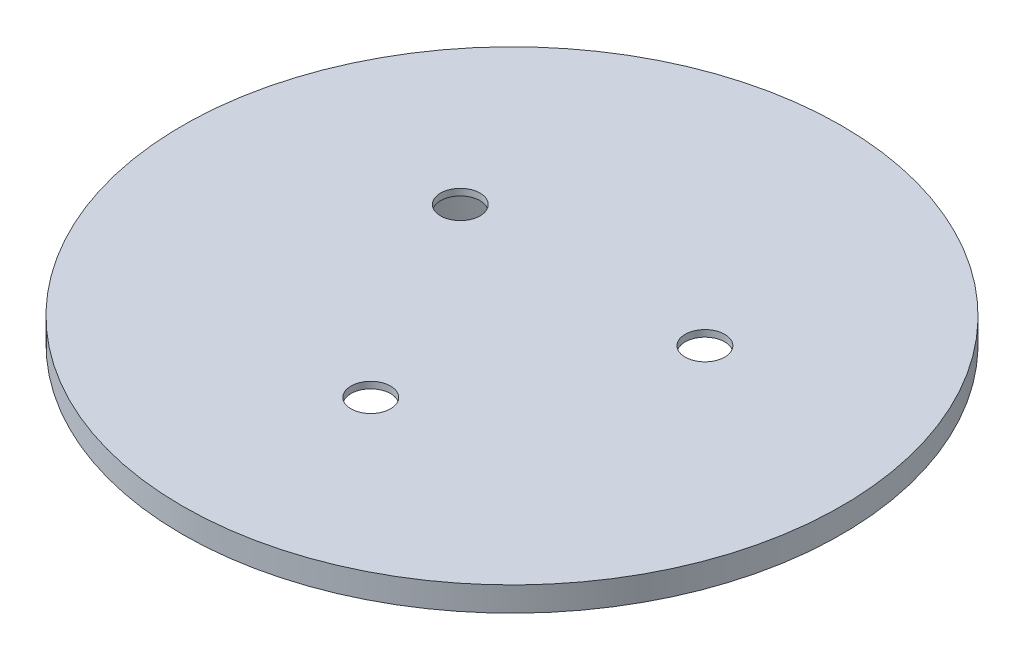
ISO-10303-21;
HEADER;
FILE_DESCRIPTION(('STEP AP214'),'2;1');
FILE_NAME('part.step','',(''),(''),'','','');
FILE_SCHEMA(('AUTOMOTIVE_DESIGN { 1 0 10303 214 1 1 1 1 }'));
ENDSEC;
DATA;
#1=APPLICATION_CONTEXT('core data for automotive mechanical design processes');
#2=APPLICATION_PROTOCOL_DEFINITION('international standard','automotive_design',2000,#1);
#3=PRODUCT_CONTEXT('',#1,'mechanical');
#4=PRODUCT('Part','Part','',(#3));
#5=PRODUCT_RELATED_PRODUCT_CATEGORY('part','',(#4));
#6=PRODUCT_DEFINITION_FORMATION('','',#4);
#7=PRODUCT_DEFINITION_CONTEXT('part definition',#1,'design');
#8=PRODUCT_DEFINITION('design','',#6,#7);
#9=PRODUCT_DEFINITION_SHAPE('','',#8);
#10=(LENGTH_UNIT() NAMED_UNIT(*) SI_UNIT(.MILLI.,.METRE.));
#11=(NAMED_UNIT(*) PLANE_ANGLE_UNIT() SI_UNIT($,.RADIAN.));
#12=(NAMED_UNIT(*) SI_UNIT($,.STERADIAN.) SOLID_ANGLE_UNIT());
#13=UNCERTAINTY_MEASURE_WITH_UNIT(LENGTH_MEASURE(1.E-05),#10,'distance_accuracy_value','');
#14=(GEOMETRIC_REPRESENTATION_CONTEXT(3) GLOBAL_UNCERTAINTY_ASSIGNED_CONTEXT((#13)) GLOBAL_UNIT_ASSIGNED_CONTEXT((#10,
#11,#12)) REPRESENTATION_CONTEXT('',''));
#15=CARTESIAN_POINT('',(0.,0.,0.));
#16=DIRECTION('',(0.,0.,1.));
#17=DIRECTION('',(1.,0.,0.));
#18=AXIS2_PLACEMENT_3D('',#15,#16,#17);
#19=CARTESIAN_POINT('',(0.,3.1,0.));
#20=DIRECTION('',(0.,-1.,0.));
#21=DIRECTION('',(0.,0.,-1.));
#22=AXIS2_PLACEMENT_3D('',#19,#20,#21);
#23=CYLINDRICAL_SURFACE('',#22,24.8);
#24=CARTESIAN_POINT('',(0.,3.1,0.));
#25=DIRECTION('',(0.,1.,0.));
#26=DIRECTION('',(0.,0.,1.));
#27=AXIS2_PLACEMENT_3D('',#24,#25,#26);
#28=CIRCLE('',#27,24.8);
#29=CARTESIAN_POINT('',(0.,3.1,-24.8));
#30=VERTEX_POINT('',#29);
#31=EDGE_CURVE('E10',#30,#30,#28,.T.);
#32=CARTESIAN_POINT('',(0.,0.,0.));
#33=DIRECTION('',(0.,1.,0.));
#34=DIRECTION('',(0.,0.,1.));
#35=AXIS2_PLACEMENT_3D('',#32,#33,#34);
#36=CIRCLE('',#35,24.8);
#37=CARTESIAN_POINT('',(0.,0.,-24.8));
#38=VERTEX_POINT('',#37);
#39=EDGE_CURVE('E35',#38,#38,#36,.T.);
#40=CARTESIAN_POINT('',(0.,3.1,-24.8));
#41=CARTESIAN_POINT('',(0.,3.06770833333333,-24.8));
#42=CARTESIAN_POINT('',(0.,3.03541666666667,-24.8));
#43=CARTESIAN_POINT('',(0.,2.97083333333333,-24.8));
#44=CARTESIAN_POINT('',(0.,2.93854166666667,-24.8));
#45=CARTESIAN_POINT('',(0.,2.87395833333333,-24.8));
#46=CARTESIAN_POINT('',(0.,2.84166666666667,-24.8));
#47=CARTESIAN_POINT('',(0.,2.77708333333333,-24.8));
#48=CARTESIAN_POINT('',(0.,2.74479166666667,-24.8));
#49=CARTESIAN_POINT('',(0.,2.68020833333333,-24.8));
#50=CARTESIAN_POINT('',(0.,2.64791666666667,-24.8));
#51=CARTESIAN_POINT('',(0.,2.58333333333333,-24.8));
#52=CARTESIAN_POINT('',(0.,2.55104166666667,-24.8));
#53=CARTESIAN_POINT('',(0.,2.48645833333333,-24.8));
#54=CARTESIAN_POINT('',(0.,2.45416666666667,-24.8));
#55=CARTESIAN_POINT('',(0.,2.38958333333333,-24.8));
#56=CARTESIAN_POINT('',(0.,2.35729166666667,-24.8));
#57=CARTESIAN_POINT('',(0.,2.29270833333333,-24.8));
#58=CARTESIAN_POINT('',(0.,2.26041666666667,-24.8));
#59=CARTESIAN_POINT('',(0.,2.19583333333333,-24.8));
#60=CARTESIAN_POINT('',(0.,2.16354166666667,-24.8));
#61=CARTESIAN_POINT('',(0.,2.09895833333333,-24.8));
#62=CARTESIAN_POINT('',(0.,2.06666666666667,-24.8));
#63=CARTESIAN_POINT('',(0.,2.00208333333333,-24.8));
#64=CARTESIAN_POINT('',(0.,1.96979166666667,-24.8));
#65=CARTESIAN_POINT('',(0.,1.90520833333333,-24.8));
#66=CARTESIAN_POINT('',(0.,1.87291666666667,-24.8));
#67=CARTESIAN_POINT('',(0.,1.80833333333333,-24.8));
#68=CARTESIAN_POINT('',(0.,1.77604166666667,-24.8));
#69=CARTESIAN_POINT('',(0.,1.71145833333333,-24.8));
#70=CARTESIAN_POINT('',(0.,1.67916666666667,-24.8));
#71=CARTESIAN_POINT('',(0.,1.61458333333333,-24.8));
#72=CARTESIAN_POINT('',(0.,1.58229166666667,-24.8));
#73=CARTESIAN_POINT('',(0.,1.51770833333333,-24.8));
#74=CARTESIAN_POINT('',(0.,1.48541666666667,-24.8));
#75=CARTESIAN_POINT('',(0.,1.42083333333333,-24.8));
#76=CARTESIAN_POINT('',(0.,1.38854166666667,-24.8));
#77=CARTESIAN_POINT('',(0.,1.32395833333333,-24.8));
#78=CARTESIAN_POINT('',(0.,1.29166666666667,-24.8));
#79=CARTESIAN_POINT('',(0.,1.22708333333333,-24.8));
#80=CARTESIAN_POINT('',(0.,1.19479166666667,-24.8));
#81=CARTESIAN_POINT('',(0.,1.13020833333333,-24.8));
#82=CARTESIAN_POINT('',(0.,1.09791666666667,-24.8));
#83=CARTESIAN_POINT('',(0.,1.03333333333333,-24.8));
#84=CARTESIAN_POINT('',(0.,1.00104166666667,-24.8));
#85=CARTESIAN_POINT('',(0.,0.936458333333333,-24.8));
#86=CARTESIAN_POINT('',(0.,0.904166666666667,-24.8));
#87=CARTESIAN_POINT('',(0.,0.839583333333333,-24.8));
#88=CARTESIAN_POINT('',(0.,0.807291666666667,-24.8));
#89=CARTESIAN_POINT('',(0.,0.742708333333333,-24.8));
#90=CARTESIAN_POINT('',(0.,0.710416666666667,-24.8));
#91=CARTESIAN_POINT('',(0.,0.645833333333333,-24.8));
#92=CARTESIAN_POINT('',(0.,0.613541666666667,-24.8));
#93=CARTESIAN_POINT('',(0.,0.548958333333333,-24.8));
#94=CARTESIAN_POINT('',(0.,0.516666666666667,-24.8));
#95=CARTESIAN_POINT('',(0.,0.452083333333333,-24.8));
#96=CARTESIAN_POINT('',(0.,0.419791666666667,-24.8));
#97=CARTESIAN_POINT('',(0.,0.355208333333333,-24.8));
#98=CARTESIAN_POINT('',(0.,0.322916666666667,-24.8));
#99=CARTESIAN_POINT('',(0.,0.258333333333333,-24.8));
#100=CARTESIAN_POINT('',(0.,0.226041666666667,-24.8));
#101=CARTESIAN_POINT('',(0.,0.161458333333333,-24.8));
#102=CARTESIAN_POINT('',(0.,0.129166666666667,-24.8));
#103=CARTESIAN_POINT('',(0.,0.0645833333333335,-24.8));
#104=CARTESIAN_POINT('',(0.,0.0322916666666667,-24.8));
#105=CARTESIAN_POINT('',(0.,0.,-24.8));
#106=B_SPLINE_CURVE_WITH_KNOTS('',3,(#40,#41,#42,#43,#44,#45,#46,#47,#48,#49,#50,#51,#52,#53,
#54,#55,#56,#57,#58,#59,#60,#61,#62,#63,#64,#65,#66,#67,#68,#69,#70,#71,#72,#73,#74,#75,#76,#77,
#78,#79,#80,#81,#82,#83,#84,#85,#86,#87,#88,#89,#90,#91,#92,#93,#94,#95,#96,#97,#98,#99,#100,
#101,#102,#103,#104,#105),.UNSPECIFIED.,.F.,.F.,(4,2,2,2,2,2,2,2,2,2,2,2,2,2,2,2,2,2,2,2,2,2,2,
2,2,2,2,2,2,2,2,2,4),(0.,0.0968749999999997,0.19375,0.290625,0.3875,0.484375,0.58125,0.678125,
0.775,0.871874999999999,0.96875,1.065625,1.1625,1.259375,1.35625,1.453125,1.55,1.646875,1.74375,
1.840625,1.9375,2.034375,2.13125,2.228125,2.325,2.421875,2.51875,2.615625,2.7125,2.809375,
2.90625,3.003125,3.1),.UNSPECIFIED.);
#107=EDGE_CURVE('BSEAM32',#30,#38,#106,.T.);
#108=ORIENTED_EDGE('',*,*,#31,.F.);
#109=ORIENTED_EDGE('',*,*,#39,.T.);
#110=ORIENTED_EDGE('',*,*,#107,.T.);
#111=ORIENTED_EDGE('',*,*,#107,.F.);
#112=EDGE_LOOP('',(#108,#110,#109,#111));
#113=FACE_BOUND('',#112,.T.);
#114=ADVANCED_FACE('F32',(#113),#23,.T.);
#115=CARTESIAN_POINT('',(0.,0.,0.));
#116=DIRECTION('',(0.,1.,0.));
#117=DIRECTION('',(0.,0.,1.));
#118=AXIS2_PLACEMENT_3D('',#115,#116,#117);
#119=PLANE('',#118);
#120=CARTESIAN_POINT('',(0.,0.,0.));
#121=DIRECTION('',(0.,-1.,0.));
#122=DIRECTION('',(0.,0.,-1.));
#123=AXIS2_PLACEMENT_3D('',#120,#121,#122);
#124=CIRCLE('',#123,20.05);
#125=CARTESIAN_POINT('',(0.,0.,-20.05));
#126=VERTEX_POINT('',#125);
#127=EDGE_CURVE('E50',#126,#126,#124,.T.);
#128=ORIENTED_EDGE('',*,*,#127,.F.);
#129=EDGE_LOOP('',(#128));
#130=FACE_BOUND('',#129,.T.);
#131=ORIENTED_EDGE('',*,*,#39,.F.);
#132=EDGE_LOOP('',(#131));
#133=FACE_BOUND('',#132,.T.);
#134=ADVANCED_FACE('F94',(#130,#133),#119,.F.);
#135=CARTESIAN_POINT('',(0.,5.7,0.));
#136=DIRECTION('',(0.,-1.,0.));
#137=DIRECTION('',(0.,0.,-1.));
#138=AXIS2_PLACEMENT_3D('',#135,#136,#137);
#139=CYLINDRICAL_SURFACE('',#138,35.);
#140=CARTESIAN_POINT('',(0.,5.7,0.));
#141=DIRECTION('',(0.,1.,0.));
#142=DIRECTION('',(0.,0.,1.));
#143=AXIS2_PLACEMENT_3D('',#140,#141,#142);
#144=CIRCLE('',#143,35.);
#145=CARTESIAN_POINT('',(0.,5.7,35.));
#146=VERTEX_POINT('',#145);
#147=EDGE_CURVE('E42',#146,#146,#144,.T.);
#148=ORIENTED_EDGE('',*,*,#147,.F.);
#149=EDGE_LOOP('',(#148));
#150=FACE_BOUND('',#149,.T.);
#151=CARTESIAN_POINT('',(0.,3.1,0.));
#152=DIRECTION('',(0.,1.,0.));
#153=DIRECTION('',(0.,0.,1.));
#154=AXIS2_PLACEMENT_3D('',#151,#152,#153);
#155=CIRCLE('',#154,35.);
#156=CARTESIAN_POINT('',(0.,3.1,35.));
#157=VERTEX_POINT('',#156);
#158=EDGE_CURVE('E44',#157,#157,#155,.T.);
#159=ORIENTED_EDGE('',*,*,#158,.T.);
#160=EDGE_LOOP('',(#159));
#161=FACE_BOUND('',#160,.T.);
#162=ADVANCED_FACE('F97',(#150,#161),#139,.T.);
#163=CARTESIAN_POINT('',(0.,5.7,0.));
#164=DIRECTION('',(0.,1.,0.));
#165=DIRECTION('',(0.,0.,1.));
#166=AXIS2_PLACEMENT_3D('',#163,#164,#165);
#167=PLANE('',#166);
#168=CARTESIAN_POINT('',(0.,5.7,15.));
#169=DIRECTION('',(0.,1.,0.));
#170=DIRECTION('',(0.,0.,1.));
#171=AXIS2_PLACEMENT_3D('',#168,#169,#170);
#172=CIRCLE('',#171,2.1);
#173=CARTESIAN_POINT('',(0.,5.7,17.1));
#174=VERTEX_POINT('',#173);
#175=EDGE_CURVE('E68',#174,#174,#172,.F.);
#176=ORIENTED_EDGE('',*,*,#175,.T.);
#177=EDGE_LOOP('',(#176));
#178=FACE_BOUND('',#177,.T.);
#179=CARTESIAN_POINT('',(-12.9903810567665,5.7,-7.50000000000006));
#180=DIRECTION('',(0.,1.,0.));
#181=DIRECTION('',(0.,0.,1.));
#182=AXIS2_PLACEMENT_3D('',#179,#180,#181);
#183=CIRCLE('',#182,2.1);
#184=CARTESIAN_POINT('',(-12.9903810567665,5.7,-5.40000000000006));
#185=VERTEX_POINT('',#184);
#186=EDGE_CURVE('E65',#185,#185,#183,.F.);
#187=ORIENTED_EDGE('',*,*,#186,.T.);
#188=EDGE_LOOP('',(#187));
#189=FACE_BOUND('',#188,.T.);
#190=CARTESIAN_POINT('',(12.9903810567665,5.7,-7.50000000000006));
#191=DIRECTION('',(0.,1.,0.));
#192=DIRECTION('',(0.,0.,1.));
#193=AXIS2_PLACEMENT_3D('',#190,#191,#192);
#194=CIRCLE('',#193,2.1);
#195=CARTESIAN_POINT('',(12.9903810567665,5.7,-5.40000000000006));
#196=VERTEX_POINT('',#195);
#197=EDGE_CURVE('E59',#196,#196,#194,.F.);
#198=ORIENTED_EDGE('',*,*,#197,.T.);
#199=EDGE_LOOP('',(#198));
#200=FACE_BOUND('',#199,.T.);
#201=ORIENTED_EDGE('',*,*,#147,.T.);
#202=EDGE_LOOP('',(#201));
#203=FACE_BOUND('',#202,.T.);
#204=ADVANCED_FACE('F116',(#178,#189,#200,#203),#167,.T.);
#205=CARTESIAN_POINT('',(0.,3.1,0.));
#206=DIRECTION('',(0.,1.,0.));
#207=DIRECTION('',(0.,0.,1.));
#208=AXIS2_PLACEMENT_3D('',#205,#206,#207);
#209=PLANE('',#208);
#210=ORIENTED_EDGE('',*,*,#31,.T.);
#211=EDGE_LOOP('',(#210));
#212=FACE_BOUND('',#211,.T.);
#213=ORIENTED_EDGE('',*,*,#158,.F.);
#214=EDGE_LOOP('',(#213));
#215=FACE_BOUND('',#214,.T.);
#216=ADVANCED_FACE('F90',(#212,#215),#209,.F.);
#217=CARTESIAN_POINT('',(0.,5.,0.));
#218=DIRECTION('',(0.,-1.,0.));
#219=DIRECTION('',(0.,0.,-1.));
#220=AXIS2_PLACEMENT_3D('',#217,#218,#219);
#221=CYLINDRICAL_SURFACE('',#220,20.05);
#222=CARTESIAN_POINT('',(0.,5.,0.));
#223=DIRECTION('',(0.,-1.,0.));
#224=DIRECTION('',(0.,0.,-1.));
#225=AXIS2_PLACEMENT_3D('',#222,#223,#224);
#226=CIRCLE('',#225,20.05);
#227=CARTESIAN_POINT('',(0.,5.,-20.05));
#228=VERTEX_POINT('',#227);
#229=EDGE_CURVE('E47',#228,#228,#226,.T.);
#230=ORIENTED_EDGE('',*,*,#229,.F.);
#231=EDGE_LOOP('',(#230));
#232=FACE_BOUND('',#231,.T.);
#233=ORIENTED_EDGE('',*,*,#127,.T.);
#234=EDGE_LOOP('',(#233));
#235=FACE_BOUND('',#234,.T.);
#236=ADVANCED_FACE('F80',(#232,#235),#221,.F.);
#237=CARTESIAN_POINT('',(0.,5.,0.));
#238=DIRECTION('',(0.,-1.,0.));
#239=DIRECTION('',(0.,0.,-1.));
#240=AXIS2_PLACEMENT_3D('',#237,#238,#239);
#241=PLANE('',#240);
#242=CARTESIAN_POINT('',(0.,5.,15.));
#243=DIRECTION('',(0.,-1.,0.));
#244=DIRECTION('',(0.,0.,-1.));
#245=AXIS2_PLACEMENT_3D('',#242,#243,#244);
#246=CIRCLE('',#245,2.1);
#247=CARTESIAN_POINT('',(0.,5.,12.9));
#248=VERTEX_POINT('',#247);
#249=EDGE_CURVE('E53',#248,#248,#246,.T.);
#250=ORIENTED_EDGE('',*,*,#249,.F.);
#251=EDGE_LOOP('',(#250));
#252=FACE_BOUND('',#251,.T.);
#253=CARTESIAN_POINT('',(-12.9903810567665,5.,-7.50000000000006));
#254=DIRECTION('',(0.,-1.,0.));
#255=DIRECTION('',(0.,0.,-1.));
#256=AXIS2_PLACEMENT_3D('',#253,#254,#255);
#257=CIRCLE('',#256,2.1);
#258=CARTESIAN_POINT('',(-12.9903810567665,5.,-9.60000000000006));
#259=VERTEX_POINT('',#258);
#260=EDGE_CURVE('E62',#259,#259,#257,.T.);
#261=ORIENTED_EDGE('',*,*,#260,.F.);
#262=EDGE_LOOP('',(#261));
#263=FACE_BOUND('',#262,.T.);
#264=CARTESIAN_POINT('',(12.9903810567665,5.,-7.50000000000006));
#265=DIRECTION('',(0.,-1.,0.));
#266=DIRECTION('',(0.,0.,-1.));
#267=AXIS2_PLACEMENT_3D('',#264,#265,#266);
#268=CIRCLE('',#267,2.1);
#269=CARTESIAN_POINT('',(12.9903810567665,5.,-9.60000000000006));
#270=VERTEX_POINT('',#269);
#271=EDGE_CURVE('E56',#270,#270,#268,.T.);
#272=ORIENTED_EDGE('',*,*,#271,.F.);
#273=EDGE_LOOP('',(#272));
#274=FACE_BOUND('',#273,.T.);
#275=ORIENTED_EDGE('',*,*,#229,.T.);
#276=EDGE_LOOP('',(#275));
#277=FACE_BOUND('',#276,.T.);
#278=ADVANCED_FACE('F76',(#252,#263,#274,#277),#241,.T.);
#279=CARTESIAN_POINT('',(12.9903810567665,5.701,-7.50000000000006));
#280=DIRECTION('',(0.,-1.,0.));
#281=DIRECTION('',(0.,0.,-1.));
#282=AXIS2_PLACEMENT_3D('',#279,#280,#281);
#283=CYLINDRICAL_SURFACE('',#282,2.1);
#284=ORIENTED_EDGE('',*,*,#197,.F.);
#285=EDGE_LOOP('',(#284));
#286=FACE_BOUND('',#285,.T.);
#287=ORIENTED_EDGE('',*,*,#271,.T.);
#288=EDGE_LOOP('',(#287));
#289=FACE_BOUND('',#288,.T.);
#290=ADVANCED_FACE('F79',(#286,#289),#283,.F.);
#291=CARTESIAN_POINT('',(-12.9903810567665,5.701,-7.50000000000006));
#292=DIRECTION('',(0.,-1.,0.));
#293=DIRECTION('',(0.,0.,-1.));
#294=AXIS2_PLACEMENT_3D('',#291,#292,#293);
#295=CYLINDRICAL_SURFACE('',#294,2.1);
#296=ORIENTED_EDGE('',*,*,#186,.F.);
#297=EDGE_LOOP('',(#296));
#298=FACE_BOUND('',#297,.T.);
#299=ORIENTED_EDGE('',*,*,#260,.T.);
#300=EDGE_LOOP('',(#299));
#301=FACE_BOUND('',#300,.T.);
#302=ADVANCED_FACE('F143',(#298,#301),#295,.F.);
#303=CARTESIAN_POINT('',(0.,5.701,15.));
#304=DIRECTION('',(0.,-1.,0.));
#305=DIRECTION('',(0.,0.,-1.));
#306=AXIS2_PLACEMENT_3D('',#303,#304,#305);
#307=CYLINDRICAL_SURFACE('',#306,2.1);
#308=ORIENTED_EDGE('',*,*,#175,.F.);
#309=EDGE_LOOP('',(#308));
#310=FACE_BOUND('',#309,.T.);
#311=ORIENTED_EDGE('',*,*,#249,.T.);
#312=EDGE_LOOP('',(#311));
#313=FACE_BOUND('',#312,.T.);
#314=ADVANCED_FACE('F74',(#310,#313),#307,.F.);
#315=CLOSED_SHELL('',(#114,#134,#162,#204,#216,#236,#278,#290,#302,#314));
#316=MANIFOLD_SOLID_BREP('B2',#315);
#317=ADVANCED_BREP_SHAPE_REPRESENTATION('',(#18,#316),#14);
#318=SHAPE_DEFINITION_REPRESENTATION(#9,#317);
ENDSEC;
END-ISO-10303-21;
